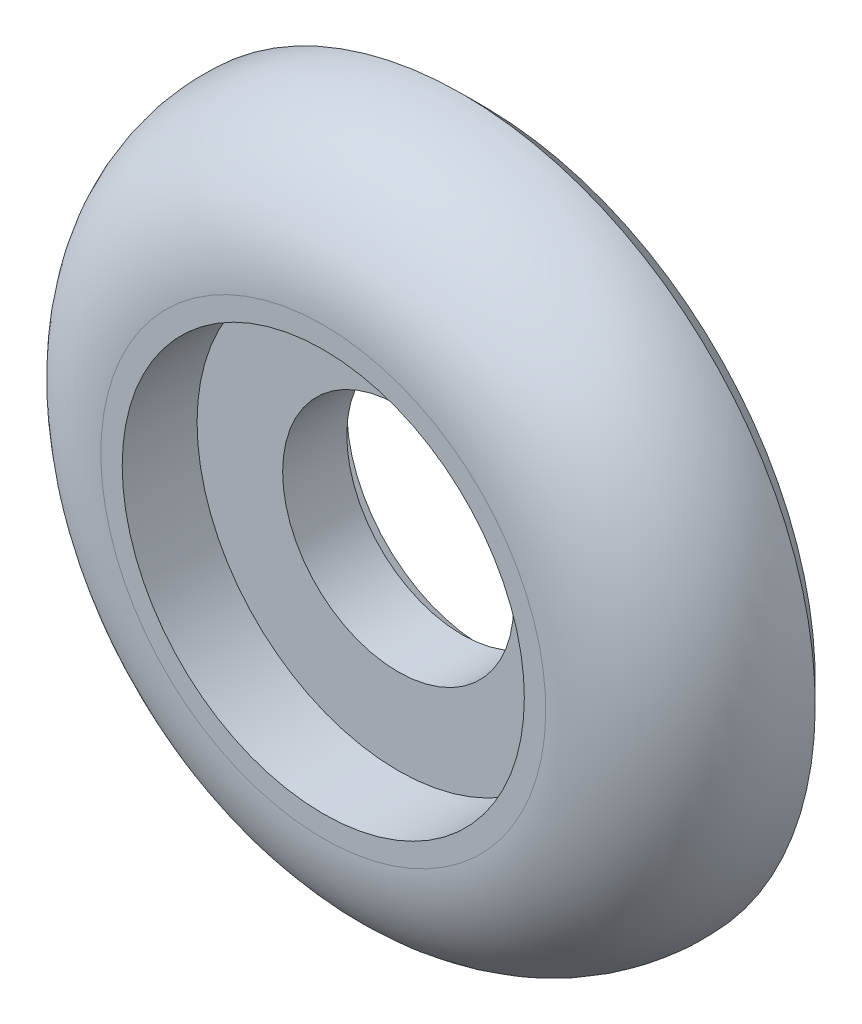
ISO-10303-21;
HEADER;
FILE_DESCRIPTION(('STEP AP214'),'2;1');
FILE_NAME('part.step','',(''),(''),'','','');
FILE_SCHEMA(('AUTOMOTIVE_DESIGN { 1 0 10303 214 1 1 1 1 }'));
ENDSEC;
DATA;
#1=APPLICATION_CONTEXT('core data for automotive mechanical design processes');
#2=APPLICATION_PROTOCOL_DEFINITION('international standard','automotive_design',2000,#1);
#3=PRODUCT_CONTEXT('',#1,'mechanical');
#4=PRODUCT('Part','Part','',(#3));
#5=PRODUCT_RELATED_PRODUCT_CATEGORY('part','',(#4));
#6=PRODUCT_DEFINITION_FORMATION('','',#4);
#7=PRODUCT_DEFINITION_CONTEXT('part definition',#1,'design');
#8=PRODUCT_DEFINITION('design','',#6,#7);
#9=PRODUCT_DEFINITION_SHAPE('','',#8);
#10=(LENGTH_UNIT() NAMED_UNIT(*) SI_UNIT(.MILLI.,.METRE.));
#11=(NAMED_UNIT(*) PLANE_ANGLE_UNIT() SI_UNIT($,.RADIAN.));
#12=(NAMED_UNIT(*) SI_UNIT($,.STERADIAN.) SOLID_ANGLE_UNIT());
#13=UNCERTAINTY_MEASURE_WITH_UNIT(LENGTH_MEASURE(1.E-05),#10,'distance_accuracy_value','');
#14=(GEOMETRIC_REPRESENTATION_CONTEXT(3) GLOBAL_UNCERTAINTY_ASSIGNED_CONTEXT((#13)) GLOBAL_UNIT_ASSIGNED_CONTEXT((#10,
#11,#12)) REPRESENTATION_CONTEXT('',''));
#15=CARTESIAN_POINT('',(0.,0.,0.));
#16=DIRECTION('',(0.,0.,1.));
#17=DIRECTION('',(1.,0.,0.));
#18=AXIS2_PLACEMENT_3D('',#15,#16,#17);
#19=CARTESIAN_POINT('',(0.,0.,-8.71737999999999));
#20=DIRECTION('',(0.,0.,1.));
#21=DIRECTION('',(-0.813826036051072,-0.581108581114923,0.));
#22=AXIS2_PLACEMENT_3D('',#19,#20,#21);
#23=CONICAL_SURFACE('',#22,0.907619999999984,0.785398163397449);
#24=CARTESIAN_POINT('',(0.,0.,-1.37499999999999));
#25=DIRECTION('',(0.,0.,-1.));
#26=DIRECTION('',(0.,-1.,0.));
#27=AXIS2_PLACEMENT_3D('',#24,#25,#26);
#28=CIRCLE('',#27,8.25);
#29=CARTESIAN_POINT('',(6.7140647974213,4.79414579419811,-1.37499999999998));
#30=VERTEX_POINT('',#29);
#31=CARTESIAN_POINT('',(0.,8.25000000000001,-1.37499999999999));
#32=VERTEX_POINT('',#31);
#33=EDGE_CURVE('E110',#30,#32,#28,.T.);
#34=ORIENTED_EDGE('',*,*,#33,.T.);
#35=CARTESIAN_POINT('',(0.,0.,-1.37499999999999));
#36=DIRECTION('',(0.,0.,-1.));
#37=DIRECTION('',(0.,-1.,0.));
#38=AXIS2_PLACEMENT_3D('',#35,#36,#37);
#39=CIRCLE('',#38,8.25);
#40=EDGE_CURVE('E20',#32,#30,#39,.T.);
#41=ORIENTED_EDGE('',*,*,#40,.T.);
#42=DIRECTION('',(-0.575461908797881,-0.410905818312054,-0.707106781186548));
#43=VECTOR('',#42,1.);
#44=CARTESIAN_POINT('',(0.738644786840603,0.527425770391506,-8.71737999999999));
#45=LINE('',#44,#43);
#46=CARTESIAN_POINT('',(6.3071517793958,4.5035915036406,-1.87499999999999));
#47=VERTEX_POINT('',#46);
#48=EDGE_CURVE('E11',#30,#47,#45,.T.);
#49=ORIENTED_EDGE('',*,*,#48,.T.);
#50=CARTESIAN_POINT('',(0.,0.,-1.875));
#51=DIRECTION('',(0.,0.,-1.));
#52=DIRECTION('',(0.,1.,0.));
#53=AXIS2_PLACEMENT_3D('',#50,#51,#52);
#54=CIRCLE('',#53,7.75);
#55=EDGE_CURVE('E124',#47,#47,#54,.T.);
#56=ORIENTED_EDGE('',*,*,#55,.F.);
#57=ORIENTED_EDGE('',*,*,#48,.F.);
#58=EDGE_LOOP('',(#34,#41,#49,#56,#57));
#59=FACE_BOUND('',#58,.T.);
#60=ADVANCED_FACE('F17',(#59),#23,.T.);
#61=CARTESIAN_POINT('',(0.,0.,-1.18115384615384));
#62=DIRECTION('',(0.,0.,1.));
#63=DIRECTION('',(0.,-1.,0.));
#64=AXIS2_PLACEMENT_3D('',#61,#62,#63);
#65=TOROIDAL_SURFACE('',#64,5.2,3.05615384615385);
#66=CARTESIAN_POINT('',(0.,0.,1.875));
#67=DIRECTION('',(0.,0.,1.));
#68=DIRECTION('',(0.,-1.,0.));
#69=AXIS2_PLACEMENT_3D('',#66,#67,#68);
#70=CIRCLE('',#69,5.2);
#71=CARTESIAN_POINT('',(0.,5.20000000000001,1.875));
#72=VERTEX_POINT('',#71);
#73=EDGE_CURVE('E123',#72,#72,#70,.T.);
#74=ORIENTED_EDGE('',*,*,#73,.F.);
#75=CARTESIAN_POINT('',(0.,5.20000000000001,-1.18115384615385));
#76=DIRECTION('',(-1.,0.,0.));
#77=DIRECTION('',(0.,1.,0.));
#78=AXIS2_PLACEMENT_3D('',#75,#76,#77);
#79=CIRCLE('',#78,3.05615384615385);
#80=EDGE_CURVE('E109',#72,#32,#79,.T.);
#81=ORIENTED_EDGE('',*,*,#80,.T.);
#82=ORIENTED_EDGE('',*,*,#33,.F.);
#83=ORIENTED_EDGE('',*,*,#40,.F.);
#84=ORIENTED_EDGE('',*,*,#80,.F.);
#85=EDGE_LOOP('',(#74,#81,#82,#83,#84));
#86=FACE_BOUND('',#85,.T.);
#87=ADVANCED_FACE('F134',(#86),#65,.T.);
#88=CARTESIAN_POINT('',(-9.65999999999999,0.,-1.875));
#89=DIRECTION('',(0.,0.,-1.));
#90=DIRECTION('',(0.,-1.,0.));
#91=AXIS2_PLACEMENT_3D('',#88,#89,#90);
#92=PLANE('',#91);
#93=CARTESIAN_POINT('',(0.,0.,-1.875));
#94=DIRECTION('',(0.,0.,-1.));
#95=DIRECTION('',(0.,1.,0.));
#96=AXIS2_PLACEMENT_3D('',#93,#94,#95);
#97=CIRCLE('',#96,3.2);
#98=CARTESIAN_POINT('',(-2.6042433153635,1.8595474595677,-1.875));
#99=VERTEX_POINT('',#98);
#100=EDGE_CURVE('E117',#99,#99,#97,.T.);
#101=ORIENTED_EDGE('',*,*,#100,.F.);
#102=EDGE_LOOP('',(#101));
#103=FACE_BOUND('',#102,.T.);
#104=ORIENTED_EDGE('',*,*,#55,.T.);
#105=EDGE_LOOP('',(#104));
#106=FACE_BOUND('',#105,.T.);
#107=ADVANCED_FACE('F135',(#103,#106),#92,.T.);
#108=CARTESIAN_POINT('',(-6.59999999999999,0.,1.875));
#109=DIRECTION('',(0.,0.,1.));
#110=DIRECTION('',(0.,-1.,0.));
#111=AXIS2_PLACEMENT_3D('',#108,#109,#110);
#112=PLANE('',#111);
#113=CARTESIAN_POINT('',(0.,0.,1.875));
#114=DIRECTION('',(0.,0.,1.));
#115=DIRECTION('',(0.,1.,0.));
#116=AXIS2_PLACEMENT_3D('',#113,#114,#115);
#117=CIRCLE('',#116,4.7);
#118=CARTESIAN_POINT('',(4.7,0.,1.875));
#119=VERTEX_POINT('',#118);
#120=EDGE_CURVE('E84',#119,#119,#117,.T.);
#121=ORIENTED_EDGE('',*,*,#120,.F.);
#122=EDGE_LOOP('',(#121));
#123=FACE_BOUND('',#122,.T.);
#124=ORIENTED_EDGE('',*,*,#73,.T.);
#125=EDGE_LOOP('',(#124));
#126=FACE_BOUND('',#125,.T.);
#127=ADVANCED_FACE('F140',(#123,#126),#112,.T.);
#128=CARTESIAN_POINT('',(0.,0.,0.972880000000013));
#129=DIRECTION('',(0.,0.,-1.));
#130=DIRECTION('',(0.81382603605108,-0.581108581114912,0.));
#131=AXIS2_PLACEMENT_3D('',#128,#129,#130);
#132=CONICAL_SURFACE('',#131,0.352120000000013,0.785398163397449);
#133=CARTESIAN_POINT('',(0.,0.,-1.37499999999999));
#134=DIRECTION('',(0.,0.,-1.));
#135=DIRECTION('',(0.,-1.,0.));
#136=AXIS2_PLACEMENT_3D('',#133,#134,#135);
#137=CIRCLE('',#136,2.7);
#138=CARTESIAN_POINT('',(2.7,0.,-1.37499999999999));
#139=VERTEX_POINT('',#138);
#140=CARTESIAN_POINT('',(-2.19733029733789,1.5689931690103,-1.37499999999997));
#141=VERTEX_POINT('',#140);
#142=EDGE_CURVE('E100',#139,#141,#137,.T.);
#143=ORIENTED_EDGE('',*,*,#142,.F.);
#144=CARTESIAN_POINT('',(0.,0.,-1.37499999999999));
#145=DIRECTION('',(0.,0.,-1.));
#146=DIRECTION('',(0.,-1.,0.));
#147=AXIS2_PLACEMENT_3D('',#144,#145,#146);
#148=CIRCLE('',#147,2.7);
#149=EDGE_CURVE('E105',#141,#139,#148,.T.);
#150=ORIENTED_EDGE('',*,*,#149,.F.);
#151=DIRECTION('',(-0.575461908797886,0.410905818312047,-0.707106781186548));
#152=VECTOR('',#151,1.);
#153=CARTESIAN_POINT('',(-0.286564423814299,0.204619953582195,0.972880000000013));
#154=LINE('',#153,#152);
#155=EDGE_CURVE('E114',#141,#99,#154,.T.);
#156=ORIENTED_EDGE('',*,*,#155,.T.);
#157=ORIENTED_EDGE('',*,*,#100,.T.);
#158=ORIENTED_EDGE('',*,*,#155,.F.);
#159=EDGE_LOOP('',(#143,#150,#156,#157,#158));
#160=FACE_BOUND('',#159,.T.);
#161=ADVANCED_FACE('F136',(#160),#132,.F.);
#162=CARTESIAN_POINT('',(0.,0.,-0.624999999999998));
#163=DIRECTION('',(0.,0.,-1.));
#164=DIRECTION('',(-1.,0.,0.));
#165=AXIS2_PLACEMENT_3D('',#162,#163,#164);
#166=CYLINDRICAL_SURFACE('',#165,2.7);
#167=ORIENTED_EDGE('',*,*,#142,.T.);
#168=ORIENTED_EDGE('',*,*,#149,.T.);
#169=DIRECTION('',(0.,0.,1.));
#170=VECTOR('',#169,1.);
#171=CARTESIAN_POINT('',(2.7,0.,-0.624999999999998));
#172=LINE('',#171,#170);
#173=CARTESIAN_POINT('',(2.7,0.,0.125000000000002));
#174=VERTEX_POINT('',#173);
#175=EDGE_CURVE('E106',#139,#174,#172,.T.);
#176=ORIENTED_EDGE('',*,*,#175,.T.);
#177=CARTESIAN_POINT('',(0.,0.,0.125000000000002));
#178=DIRECTION('',(0.,0.,-1.));
#179=DIRECTION('',(0.,1.,0.));
#180=AXIS2_PLACEMENT_3D('',#177,#178,#179);
#181=CIRCLE('',#180,2.7);
#182=EDGE_CURVE('E93',#174,#174,#181,.T.);
#183=ORIENTED_EDGE('',*,*,#182,.F.);
#184=ORIENTED_EDGE('',*,*,#175,.F.);
#185=EDGE_LOOP('',(#167,#168,#176,#183,#184));
#186=FACE_BOUND('',#185,.T.);
#187=ADVANCED_FACE('F150',(#186),#166,.F.);
#188=CARTESIAN_POINT('',(-6.,0.,0.125000000000002));
#189=DIRECTION('',(0.,0.,1.));
#190=DIRECTION('',(0.,-1.,0.));
#191=AXIS2_PLACEMENT_3D('',#188,#189,#190);
#192=PLANE('',#191);
#193=ORIENTED_EDGE('',*,*,#182,.T.);
#194=EDGE_LOOP('',(#193));
#195=FACE_BOUND('',#194,.T.);
#196=CARTESIAN_POINT('',(0.,0.,0.125000000000002));
#197=DIRECTION('',(0.,0.,-1.));
#198=DIRECTION('',(0.,-1.,0.));
#199=AXIS2_PLACEMENT_3D('',#196,#197,#198);
#200=CIRCLE('',#199,4.7);
#201=CARTESIAN_POINT('',(4.7,0.,0.125000000000002));
#202=VERTEX_POINT('',#201);
#203=EDGE_CURVE('E82',#202,#202,#200,.T.);
#204=ORIENTED_EDGE('',*,*,#203,.F.);
#205=EDGE_LOOP('',(#204));
#206=FACE_BOUND('',#205,.T.);
#207=ADVANCED_FACE('F195',(#195,#206),#192,.T.);
#208=CARTESIAN_POINT('',(0.,0.,1.00000000000001));
#209=DIRECTION('',(0.,0.,-1.));
#210=DIRECTION('',(-1.,0.,0.));
#211=AXIS2_PLACEMENT_3D('',#208,#209,#210);
#212=CYLINDRICAL_SURFACE('',#211,4.7);
#213=ORIENTED_EDGE('',*,*,#203,.T.);
#214=DIRECTION('',(0.,0.,1.));
#215=VECTOR('',#214,1.);
#216=CARTESIAN_POINT('',(4.7,0.,1.00000000000001));
#217=LINE('',#216,#215);
#218=EDGE_CURVE('E77',#202,#119,#217,.T.);
#219=ORIENTED_EDGE('',*,*,#218,.T.);
#220=ORIENTED_EDGE('',*,*,#120,.T.);
#221=ORIENTED_EDGE('',*,*,#218,.F.);
#222=EDGE_LOOP('',(#213,#219,#220,#221));
#223=FACE_BOUND('',#222,.T.);
#224=ADVANCED_FACE('F78',(#223),#212,.F.);
#225=CLOSED_SHELL('',(#60,#87,#107,#127,#161,#187,#207,#224));
#226=MANIFOLD_SOLID_BREP('B1',#225);
#227=ADVANCED_BREP_SHAPE_REPRESENTATION('',(#18,#226),#14);
#228=SHAPE_DEFINITION_REPRESENTATION(#9,#227);
ENDSEC;
END-ISO-10303-21;
